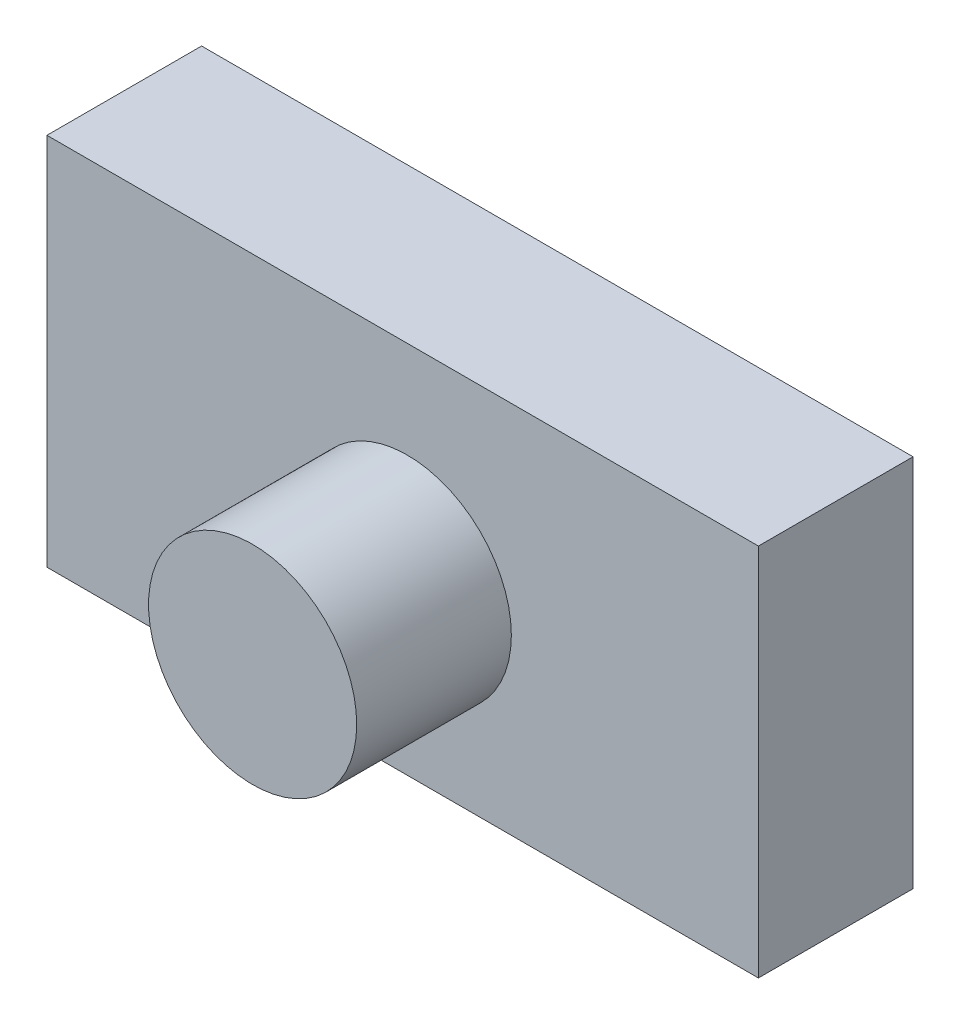
ISO-10303-21;
HEADER;
FILE_DESCRIPTION(('STEP AP214'),'2;1');
FILE_NAME('part.step','',(''),(''),'','','');
FILE_SCHEMA(('AUTOMOTIVE_DESIGN { 1 0 10303 214 1 1 1 1 }'));
ENDSEC;
DATA;
#1=APPLICATION_CONTEXT('core data for automotive mechanical design processes');
#2=APPLICATION_PROTOCOL_DEFINITION('international standard','automotive_design',2000,#1);
#3=PRODUCT_CONTEXT('',#1,'mechanical');
#4=PRODUCT('Part','Part','',(#3));
#5=PRODUCT_RELATED_PRODUCT_CATEGORY('part','',(#4));
#6=PRODUCT_DEFINITION_FORMATION('','',#4);
#7=PRODUCT_DEFINITION_CONTEXT('part definition',#1,'design');
#8=PRODUCT_DEFINITION('design','',#6,#7);
#9=PRODUCT_DEFINITION_SHAPE('','',#8);
#10=(LENGTH_UNIT() NAMED_UNIT(*) SI_UNIT(.MILLI.,.METRE.));
#11=(NAMED_UNIT(*) PLANE_ANGLE_UNIT() SI_UNIT($,.RADIAN.));
#12=(NAMED_UNIT(*) SI_UNIT($,.STERADIAN.) SOLID_ANGLE_UNIT());
#13=UNCERTAINTY_MEASURE_WITH_UNIT(LENGTH_MEASURE(1.E-05),#10,'distance_accuracy_value','');
#14=(GEOMETRIC_REPRESENTATION_CONTEXT(3) GLOBAL_UNCERTAINTY_ASSIGNED_CONTEXT((#13)) GLOBAL_UNIT_ASSIGNED_CONTEXT((#10,
#11,#12)) REPRESENTATION_CONTEXT('',''));
#15=CARTESIAN_POINT('',(0.,0.,0.));
#16=DIRECTION('',(0.,0.,1.));
#17=DIRECTION('',(1.,0.,0.));
#18=AXIS2_PLACEMENT_3D('',#15,#16,#17);
#19=CARTESIAN_POINT('',(-48.9300613496933,27.2699386503068,21.));
#20=DIRECTION('',(1.,0.,0.));
#21=DIRECTION('',(0.,0.,-1.));
#22=AXIS2_PLACEMENT_3D('',#19,#20,#21);
#23=PLANE('',#22);
#24=DIRECTION('',(0.,-1.,0.));
#25=VECTOR('',#24,1.);
#26=CARTESIAN_POINT('',(-48.9300613496933,27.2699386503068,0.));
#27=LINE('',#26,#25);
#28=CARTESIAN_POINT('',(-48.9300613496933,27.2699386503068,0.));
#29=VERTEX_POINT('',#28);
#30=CARTESIAN_POINT('',(-48.9300613496933,-23.5300613496932,0.));
#31=VERTEX_POINT('',#30);
#32=EDGE_CURVE('E107',#29,#31,#27,.T.);
#33=ORIENTED_EDGE('',*,*,#32,.T.);
#34=DIRECTION('',(0.,0.,-1.));
#35=VECTOR('',#34,1.);
#36=CARTESIAN_POINT('',(-48.9300613496933,-23.5300613496932,21.));
#37=LINE('',#36,#35);
#38=CARTESIAN_POINT('',(-48.9300613496933,-23.5300613496932,21.));
#39=VERTEX_POINT('',#38);
#40=EDGE_CURVE('E44',#39,#31,#37,.T.);
#41=ORIENTED_EDGE('',*,*,#40,.F.);
#42=DIRECTION('',(0.,-1.,0.));
#43=VECTOR('',#42,1.);
#44=CARTESIAN_POINT('',(-48.9300613496933,27.2699386503068,21.));
#45=LINE('',#44,#43);
#46=CARTESIAN_POINT('',(-48.9300613496933,27.2699386503068,21.));
#47=VERTEX_POINT('',#46);
#48=EDGE_CURVE('E92',#47,#39,#45,.T.);
#49=ORIENTED_EDGE('',*,*,#48,.F.);
#50=DIRECTION('',(0.,0.,-1.));
#51=VECTOR('',#50,1.);
#52=CARTESIAN_POINT('',(-48.9300613496933,27.2699386503068,21.));
#53=LINE('',#52,#51);
#54=EDGE_CURVE('E58',#47,#29,#53,.T.);
#55=ORIENTED_EDGE('',*,*,#54,.T.);
#56=EDGE_LOOP('',(#33,#41,#49,#55));
#57=FACE_BOUND('',#56,.T.);
#58=ADVANCED_FACE('F41',(#57),#23,.F.);
#59=CARTESIAN_POINT('',(-48.9300613496933,-23.5300613496932,21.));
#60=DIRECTION('',(0.,1.,0.));
#61=DIRECTION('',(0.,0.,1.));
#62=AXIS2_PLACEMENT_3D('',#59,#60,#61);
#63=PLANE('',#62);
#64=DIRECTION('',(1.,0.,0.));
#65=VECTOR('',#64,1.);
#66=CARTESIAN_POINT('',(-48.9300613496933,-23.5300613496932,0.));
#67=LINE('',#66,#65);
#68=CARTESIAN_POINT('',(47.683435582822,-23.5300613496932,0.));
#69=VERTEX_POINT('',#68);
#70=EDGE_CURVE('E98',#31,#69,#67,.T.);
#71=ORIENTED_EDGE('',*,*,#70,.T.);
#72=DIRECTION('',(0.,0.,-1.));
#73=VECTOR('',#72,1.);
#74=CARTESIAN_POINT('',(47.683435582822,-23.5300613496932,21.));
#75=LINE('',#74,#73);
#76=CARTESIAN_POINT('',(47.683435582822,-23.5300613496932,21.));
#77=VERTEX_POINT('',#76);
#78=EDGE_CURVE('E96',#77,#69,#75,.T.);
#79=ORIENTED_EDGE('',*,*,#78,.F.);
#80=DIRECTION('',(1.,0.,0.));
#81=VECTOR('',#80,1.);
#82=CARTESIAN_POINT('',(-48.9300613496933,-23.5300613496932,21.));
#83=LINE('',#82,#81);
#84=EDGE_CURVE('E84',#39,#77,#83,.T.);
#85=ORIENTED_EDGE('',*,*,#84,.F.);
#86=ORIENTED_EDGE('',*,*,#40,.T.);
#87=EDGE_LOOP('',(#71,#79,#85,#86));
#88=FACE_BOUND('',#87,.T.);
#89=ADVANCED_FACE('F97',(#88),#63,.F.);
#90=CARTESIAN_POINT('',(47.683435582822,27.2699386503068,21.));
#91=DIRECTION('',(1.,0.,0.));
#92=DIRECTION('',(0.,0.,-1.));
#93=AXIS2_PLACEMENT_3D('',#90,#91,#92);
#94=PLANE('',#93);
#95=DIRECTION('',(0.,-1.,0.));
#96=VECTOR('',#95,1.);
#97=CARTESIAN_POINT('',(47.683435582822,27.2699386503068,0.));
#98=LINE('',#97,#96);
#99=CARTESIAN_POINT('',(47.683435582822,27.2699386503068,0.));
#100=VERTEX_POINT('',#99);
#101=EDGE_CURVE('E111',#100,#69,#98,.T.);
#102=ORIENTED_EDGE('',*,*,#101,.F.);
#103=DIRECTION('',(0.,0.,-1.));
#104=VECTOR('',#103,1.);
#105=CARTESIAN_POINT('',(47.683435582822,27.2699386503068,21.));
#106=LINE('',#105,#104);
#107=CARTESIAN_POINT('',(47.683435582822,27.2699386503068,21.));
#108=VERTEX_POINT('',#107);
#109=EDGE_CURVE('E72',#108,#100,#106,.T.);
#110=ORIENTED_EDGE('',*,*,#109,.F.);
#111=DIRECTION('',(0.,-1.,0.));
#112=VECTOR('',#111,1.);
#113=CARTESIAN_POINT('',(47.683435582822,27.2699386503068,21.));
#114=LINE('',#113,#112);
#115=EDGE_CURVE('E91',#108,#77,#114,.T.);
#116=ORIENTED_EDGE('',*,*,#115,.T.);
#117=ORIENTED_EDGE('',*,*,#78,.T.);
#118=EDGE_LOOP('',(#102,#110,#116,#117));
#119=FACE_BOUND('',#118,.T.);
#120=ADVANCED_FACE('F101',(#119),#94,.T.);
#121=CARTESIAN_POINT('',(-48.9300613496933,27.2699386503068,21.));
#122=DIRECTION('',(0.,1.,0.));
#123=DIRECTION('',(0.,0.,1.));
#124=AXIS2_PLACEMENT_3D('',#121,#122,#123);
#125=PLANE('',#124);
#126=DIRECTION('',(1.,0.,0.));
#127=VECTOR('',#126,1.);
#128=CARTESIAN_POINT('',(-48.9300613496933,27.2699386503068,0.));
#129=LINE('',#128,#127);
#130=EDGE_CURVE('E113',#29,#100,#129,.T.);
#131=ORIENTED_EDGE('',*,*,#130,.F.);
#132=ORIENTED_EDGE('',*,*,#54,.F.);
#133=DIRECTION('',(1.,0.,0.));
#134=VECTOR('',#133,1.);
#135=CARTESIAN_POINT('',(-48.9300613496933,27.2699386503068,21.));
#136=LINE('',#135,#134);
#137=EDGE_CURVE('E102',#47,#108,#136,.T.);
#138=ORIENTED_EDGE('',*,*,#137,.T.);
#139=ORIENTED_EDGE('',*,*,#109,.T.);
#140=EDGE_LOOP('',(#131,#132,#138,#139));
#141=FACE_BOUND('',#140,.T.);
#142=ADVANCED_FACE('F132',(#141),#125,.T.);
#143=CARTESIAN_POINT('',(0.,0.,21.));
#144=DIRECTION('',(0.,0.,1.));
#145=DIRECTION('',(1.,0.,0.));
#146=AXIS2_PLACEMENT_3D('',#143,#144,#145);
#147=PLANE('',#146);
#148=CARTESIAN_POINT('',(0.,0.,21.));
#149=DIRECTION('',(0.,0.,1.));
#150=DIRECTION('',(1.,0.,0.));
#151=AXIS2_PLACEMENT_3D('',#148,#149,#150);
#152=CIRCLE('',#151,14.1341808439686);
#153=CARTESIAN_POINT('',(14.1341808439686,0.,21.));
#154=VERTEX_POINT('',#153);
#155=EDGE_CURVE('E11',#154,#154,#152,.T.);
#156=ORIENTED_EDGE('',*,*,#155,.F.);
#157=EDGE_LOOP('',(#156));
#158=FACE_BOUND('',#157,.T.);
#159=ORIENTED_EDGE('',*,*,#48,.T.);
#160=ORIENTED_EDGE('',*,*,#84,.T.);
#161=ORIENTED_EDGE('',*,*,#115,.F.);
#162=ORIENTED_EDGE('',*,*,#137,.F.);
#163=EDGE_LOOP('',(#159,#160,#161,#162));
#164=FACE_BOUND('',#163,.T.);
#165=ADVANCED_FACE('F88',(#158,#164),#147,.T.);
#166=CARTESIAN_POINT('',(0.,0.,0.));
#167=DIRECTION('',(0.,0.,1.));
#168=DIRECTION('',(1.,0.,0.));
#169=AXIS2_PLACEMENT_3D('',#166,#167,#168);
#170=PLANE('',#169);
#171=ORIENTED_EDGE('',*,*,#32,.F.);
#172=ORIENTED_EDGE('',*,*,#130,.T.);
#173=ORIENTED_EDGE('',*,*,#101,.T.);
#174=ORIENTED_EDGE('',*,*,#70,.F.);
#175=EDGE_LOOP('',(#171,#172,#173,#174));
#176=FACE_BOUND('',#175,.T.);
#177=ADVANCED_FACE('F127',(#176),#170,.F.);
#178=CARTESIAN_POINT('',(0.,0.,42.));
#179=DIRECTION('',(0.,0.,-1.));
#180=DIRECTION('',(-1.,0.,0.));
#181=AXIS2_PLACEMENT_3D('',#178,#179,#180);
#182=CYLINDRICAL_SURFACE('',#181,14.1341808439686);
#183=CARTESIAN_POINT('',(0.,0.,42.));
#184=DIRECTION('',(0.,0.,1.));
#185=DIRECTION('',(1.,0.,0.));
#186=AXIS2_PLACEMENT_3D('',#183,#184,#185);
#187=CIRCLE('',#186,14.1341808439686);
#188=CARTESIAN_POINT('',(14.1341808439686,0.,42.));
#189=VERTEX_POINT('',#188);
#190=EDGE_CURVE('E109',#189,#189,#187,.T.);
#191=ORIENTED_EDGE('',*,*,#190,.F.);
#192=EDGE_LOOP('',(#191));
#193=FACE_BOUND('',#192,.T.);
#194=ORIENTED_EDGE('',*,*,#155,.T.);
#195=EDGE_LOOP('',(#194));
#196=FACE_BOUND('',#195,.T.);
#197=ADVANCED_FACE('F124',(#193,#196),#182,.T.);
#198=CARTESIAN_POINT('',(0.,0.,42.));
#199=DIRECTION('',(0.,0.,1.));
#200=DIRECTION('',(1.,0.,0.));
#201=AXIS2_PLACEMENT_3D('',#198,#199,#200);
#202=PLANE('',#201);
#203=ORIENTED_EDGE('',*,*,#190,.T.);
#204=EDGE_LOOP('',(#203));
#205=FACE_BOUND('',#204,.T.);
#206=ADVANCED_FACE('F122',(#205),#202,.T.);
#207=CLOSED_SHELL('',(#58,#89,#120,#142,#165,#177,#197,#206));
#208=MANIFOLD_SOLID_BREP('B2',#207);
#209=ADVANCED_BREP_SHAPE_REPRESENTATION('',(#18,#208),#14);
#210=SHAPE_DEFINITION_REPRESENTATION(#9,#209);
ENDSEC;
END-ISO-10303-21;
